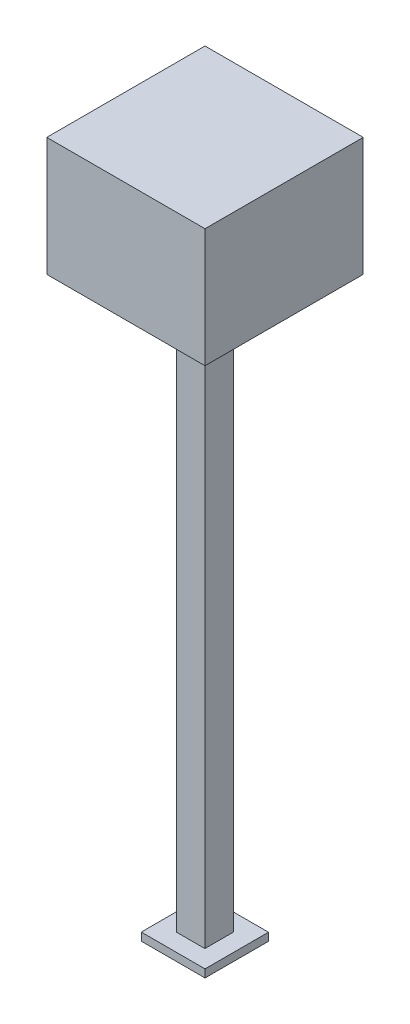
ISO-10303-21;
HEADER;
FILE_DESCRIPTION(('STEP AP214'),'2;1');
FILE_NAME('part.step','',(''),(''),'','','');
FILE_SCHEMA(('AUTOMOTIVE_DESIGN { 1 0 10303 214 1 1 1 1 }'));
ENDSEC;
DATA;
#1=APPLICATION_CONTEXT('core data for automotive mechanical design processes');
#2=APPLICATION_PROTOCOL_DEFINITION('international standard','automotive_design',2000,#1);
#3=PRODUCT_CONTEXT('',#1,'mechanical');
#4=PRODUCT('Part','Part','',(#3));
#5=PRODUCT_RELATED_PRODUCT_CATEGORY('part','',(#4));
#6=PRODUCT_DEFINITION_FORMATION('','',#4);
#7=PRODUCT_DEFINITION_CONTEXT('part definition',#1,'design');
#8=PRODUCT_DEFINITION('design','',#6,#7);
#9=PRODUCT_DEFINITION_SHAPE('','',#8);
#10=(LENGTH_UNIT() NAMED_UNIT(*) SI_UNIT(.MILLI.,.METRE.));
#11=(NAMED_UNIT(*) PLANE_ANGLE_UNIT() SI_UNIT($,.RADIAN.));
#12=(NAMED_UNIT(*) SI_UNIT($,.STERADIAN.) SOLID_ANGLE_UNIT());
#13=UNCERTAINTY_MEASURE_WITH_UNIT(LENGTH_MEASURE(1.E-05),#10,'distance_accuracy_value','');
#14=(GEOMETRIC_REPRESENTATION_CONTEXT(3) GLOBAL_UNCERTAINTY_ASSIGNED_CONTEXT((#13)) GLOBAL_UNIT_ASSIGNED_CONTEXT((#10,
#11,#12)) REPRESENTATION_CONTEXT('',''));
#15=CARTESIAN_POINT('',(0.,0.,0.));
#16=DIRECTION('',(0.,0.,1.));
#17=DIRECTION('',(1.,0.,0.));
#18=AXIS2_PLACEMENT_3D('',#15,#16,#17);
#19=CARTESIAN_POINT('',(0.,360.,0.));
#20=DIRECTION('',(-1.,0.,0.));
#21=DIRECTION('',(0.,0.,1.));
#22=AXIS2_PLACEMENT_3D('',#19,#20,#21);
#23=PLANE('',#22);
#24=DIRECTION('',(0.,0.,-1.));
#25=VECTOR('',#24,1.);
#26=CARTESIAN_POINT('',(0.,0.,0.));
#27=LINE('',#26,#25);
#28=CARTESIAN_POINT('',(0.,0.,0.));
#29=VERTEX_POINT('',#28);
#30=CARTESIAN_POINT('',(0.,0.,-18.));
#31=VERTEX_POINT('',#30);
#32=EDGE_CURVE('E205',#29,#31,#27,.T.);
#33=ORIENTED_EDGE('',*,*,#32,.T.);
#34=DIRECTION('',(0.,-1.,0.));
#35=VECTOR('',#34,1.);
#36=CARTESIAN_POINT('',(0.,360.,-18.));
#37=LINE('',#36,#35);
#38=CARTESIAN_POINT('',(0.,360.,-18.));
#39=VERTEX_POINT('',#38);
#40=EDGE_CURVE('E11',#39,#31,#37,.T.);
#41=ORIENTED_EDGE('',*,*,#40,.F.);
#42=DIRECTION('',(0.,0.,-1.));
#43=VECTOR('',#42,1.);
#44=CARTESIAN_POINT('',(0.,360.,0.));
#45=LINE('',#44,#43);
#46=CARTESIAN_POINT('',(0.,360.,0.));
#47=VERTEX_POINT('',#46);
#48=EDGE_CURVE('E206',#47,#39,#45,.T.);
#49=ORIENTED_EDGE('',*,*,#48,.F.);
#50=DIRECTION('',(0.,-1.,0.));
#51=VECTOR('',#50,1.);
#52=CARTESIAN_POINT('',(0.,360.,0.));
#53=LINE('',#52,#51);
#54=EDGE_CURVE('E223',#47,#29,#53,.T.);
#55=ORIENTED_EDGE('',*,*,#54,.T.);
#56=EDGE_LOOP('',(#33,#41,#49,#55));
#57=FACE_BOUND('',#56,.T.);
#58=ADVANCED_FACE('F43',(#57),#23,.F.);
#59=CARTESIAN_POINT('',(0.,360.,-18.));
#60=DIRECTION('',(0.,0.,1.));
#61=DIRECTION('',(1.,0.,0.));
#62=AXIS2_PLACEMENT_3D('',#59,#60,#61);
#63=PLANE('',#62);
#64=DIRECTION('',(-1.,0.,0.));
#65=VECTOR('',#64,1.);
#66=CARTESIAN_POINT('',(0.,0.,-18.));
#67=LINE('',#66,#65);
#68=CARTESIAN_POINT('',(-18.,0.,-18.));
#69=VERTEX_POINT('',#68);
#70=EDGE_CURVE('E227',#31,#69,#67,.T.);
#71=ORIENTED_EDGE('',*,*,#70,.T.);
#72=DIRECTION('',(0.,-1.,0.));
#73=VECTOR('',#72,1.);
#74=CARTESIAN_POINT('',(-18.,360.,-18.));
#75=LINE('',#74,#73);
#76=CARTESIAN_POINT('',(-18.,360.,-18.));
#77=VERTEX_POINT('',#76);
#78=EDGE_CURVE('E52',#77,#69,#75,.T.);
#79=ORIENTED_EDGE('',*,*,#78,.F.);
#80=DIRECTION('',(-1.,0.,0.));
#81=VECTOR('',#80,1.);
#82=CARTESIAN_POINT('',(0.,360.,-18.));
#83=LINE('',#82,#81);
#84=EDGE_CURVE('E210',#39,#77,#83,.T.);
#85=ORIENTED_EDGE('',*,*,#84,.F.);
#86=ORIENTED_EDGE('',*,*,#40,.T.);
#87=EDGE_LOOP('',(#71,#79,#85,#86));
#88=FACE_BOUND('',#87,.T.);
#89=ADVANCED_FACE('F246',(#88),#63,.F.);
#90=CARTESIAN_POINT('',(-18.,360.,0.));
#91=DIRECTION('',(1.,0.,0.));
#92=DIRECTION('',(0.,0.,-1.));
#93=AXIS2_PLACEMENT_3D('',#90,#91,#92);
#94=PLANE('',#93);
#95=DIRECTION('',(0.,0.,1.));
#96=VECTOR('',#95,1.);
#97=CARTESIAN_POINT('',(-18.,0.,0.));
#98=LINE('',#97,#96);
#99=CARTESIAN_POINT('',(-18.,0.,0.));
#100=VERTEX_POINT('',#99);
#101=EDGE_CURVE('E231',#69,#100,#98,.T.);
#102=ORIENTED_EDGE('',*,*,#101,.T.);
#103=DIRECTION('',(0.,-1.,0.));
#104=VECTOR('',#103,1.);
#105=CARTESIAN_POINT('',(-18.,360.,0.));
#106=LINE('',#105,#104);
#107=CARTESIAN_POINT('',(-18.,360.,0.));
#108=VERTEX_POINT('',#107);
#109=EDGE_CURVE('E59',#108,#100,#106,.T.);
#110=ORIENTED_EDGE('',*,*,#109,.F.);
#111=DIRECTION('',(0.,0.,1.));
#112=VECTOR('',#111,1.);
#113=CARTESIAN_POINT('',(-18.,360.,0.));
#114=LINE('',#113,#112);
#115=EDGE_CURVE('E215',#77,#108,#114,.T.);
#116=ORIENTED_EDGE('',*,*,#115,.F.);
#117=ORIENTED_EDGE('',*,*,#78,.T.);
#118=EDGE_LOOP('',(#102,#110,#116,#117));
#119=FACE_BOUND('',#118,.T.);
#120=ADVANCED_FACE('F243',(#119),#94,.F.);
#121=CARTESIAN_POINT('',(0.,360.,0.));
#122=DIRECTION('',(0.,0.,-1.));
#123=DIRECTION('',(-1.,0.,0.));
#124=AXIS2_PLACEMENT_3D('',#121,#122,#123);
#125=PLANE('',#124);
#126=DIRECTION('',(1.,0.,0.));
#127=VECTOR('',#126,1.);
#128=CARTESIAN_POINT('',(0.,0.,0.));
#129=LINE('',#128,#127);
#130=EDGE_CURVE('E211',#100,#29,#129,.T.);
#131=ORIENTED_EDGE('',*,*,#130,.T.);
#132=ORIENTED_EDGE('',*,*,#54,.F.);
#133=DIRECTION('',(1.,0.,0.));
#134=VECTOR('',#133,1.);
#135=CARTESIAN_POINT('',(0.,360.,0.));
#136=LINE('',#135,#134);
#137=EDGE_CURVE('E219',#108,#47,#136,.T.);
#138=ORIENTED_EDGE('',*,*,#137,.F.);
#139=ORIENTED_EDGE('',*,*,#109,.T.);
#140=EDGE_LOOP('',(#131,#132,#138,#139));
#141=FACE_BOUND('',#140,.T.);
#142=ADVANCED_FACE('F253',(#141),#125,.F.);
#143=CARTESIAN_POINT('',(0.,360.,0.));
#144=DIRECTION('',(0.,1.,0.));
#145=DIRECTION('',(0.,0.,1.));
#146=AXIS2_PLACEMENT_3D('',#143,#144,#145);
#147=PLANE('',#146);
#148=DIRECTION('',(0.,0.,1.));
#149=VECTOR('',#148,1.);
#150=CARTESIAN_POINT('',(-58.9613730566852,360.,40.9632642239142));
#151=LINE('',#150,#149);
#152=CARTESIAN_POINT('',(-58.9613730566852,360.,-59.0367357760859));
#153=VERTEX_POINT('',#152);
#154=CARTESIAN_POINT('',(-58.9613730566852,360.,40.9632642239142));
#155=VERTEX_POINT('',#154);
#156=EDGE_CURVE('E157',#153,#155,#151,.T.);
#157=ORIENTED_EDGE('',*,*,#156,.F.);
#158=DIRECTION('',(-1.,0.,0.));
#159=VECTOR('',#158,1.);
#160=CARTESIAN_POINT('',(41.0386269433146,360.,-59.0367357760859));
#161=LINE('',#160,#159);
#162=CARTESIAN_POINT('',(41.0386269433146,360.,-59.0367357760859));
#163=VERTEX_POINT('',#162);
#164=EDGE_CURVE('E173',#163,#153,#161,.T.);
#165=ORIENTED_EDGE('',*,*,#164,.F.);
#166=DIRECTION('',(0.,0.,-1.));
#167=VECTOR('',#166,1.);
#168=CARTESIAN_POINT('',(41.0386269433146,360.,40.9632642239142));
#169=LINE('',#168,#167);
#170=CARTESIAN_POINT('',(41.0386269433146,360.,40.9632642239142));
#171=VERTEX_POINT('',#170);
#172=EDGE_CURVE('E185',#171,#163,#169,.T.);
#173=ORIENTED_EDGE('',*,*,#172,.F.);
#174=DIRECTION('',(1.,0.,0.));
#175=VECTOR('',#174,1.);
#176=CARTESIAN_POINT('',(41.0386269433146,360.,40.9632642239142));
#177=LINE('',#176,#175);
#178=EDGE_CURVE('E162',#155,#171,#177,.T.);
#179=ORIENTED_EDGE('',*,*,#178,.F.);
#180=EDGE_LOOP('',(#157,#165,#173,#179));
#181=FACE_BOUND('',#180,.T.);
#182=ORIENTED_EDGE('',*,*,#137,.T.);
#183=ORIENTED_EDGE('',*,*,#48,.T.);
#184=ORIENTED_EDGE('',*,*,#84,.T.);
#185=ORIENTED_EDGE('',*,*,#115,.T.);
#186=EDGE_LOOP('',(#182,#183,#184,#185));
#187=FACE_BOUND('',#186,.T.);
#188=ADVANCED_FACE('F256',(#181,#187),#147,.F.);
#189=CARTESIAN_POINT('',(-58.9613730566852,435.,40.9632642239142));
#190=DIRECTION('',(1.,0.,0.));
#191=DIRECTION('',(0.,0.,-1.));
#192=AXIS2_PLACEMENT_3D('',#189,#190,#191);
#193=PLANE('',#192);
#194=ORIENTED_EDGE('',*,*,#156,.T.);
#195=DIRECTION('',(0.,-1.,0.));
#196=VECTOR('',#195,1.);
#197=CARTESIAN_POINT('',(-58.9613730566852,435.,40.9632642239142));
#198=LINE('',#197,#196);
#199=CARTESIAN_POINT('',(-58.9613730566852,435.,40.9632642239142));
#200=VERTEX_POINT('',#199);
#201=EDGE_CURVE('E201',#200,#155,#198,.T.);
#202=ORIENTED_EDGE('',*,*,#201,.F.);
#203=DIRECTION('',(0.,0.,1.));
#204=VECTOR('',#203,1.);
#205=CARTESIAN_POINT('',(-58.9613730566852,435.,40.9632642239142));
#206=LINE('',#205,#204);
#207=CARTESIAN_POINT('',(-58.9613730566852,435.,-59.0367357760859));
#208=VERTEX_POINT('',#207);
#209=EDGE_CURVE('E168',#208,#200,#206,.T.);
#210=ORIENTED_EDGE('',*,*,#209,.F.);
#211=DIRECTION('',(0.,-1.,0.));
#212=VECTOR('',#211,1.);
#213=CARTESIAN_POINT('',(-58.9613730566852,435.,-59.0367357760859));
#214=LINE('',#213,#212);
#215=EDGE_CURVE('E181',#208,#153,#214,.T.);
#216=ORIENTED_EDGE('',*,*,#215,.T.);
#217=EDGE_LOOP('',(#194,#202,#210,#216));
#218=FACE_BOUND('',#217,.T.);
#219=ADVANCED_FACE('F258',(#218),#193,.F.);
#220=CARTESIAN_POINT('',(41.0386269433146,435.,40.9632642239142));
#221=DIRECTION('',(0.,0.,-1.));
#222=DIRECTION('',(-1.,0.,0.));
#223=AXIS2_PLACEMENT_3D('',#220,#221,#222);
#224=PLANE('',#223);
#225=ORIENTED_EDGE('',*,*,#178,.T.);
#226=DIRECTION('',(0.,-1.,0.));
#227=VECTOR('',#226,1.);
#228=CARTESIAN_POINT('',(41.0386269433146,435.,40.9632642239142));
#229=LINE('',#228,#227);
#230=CARTESIAN_POINT('',(41.0386269433146,435.,40.9632642239142));
#231=VERTEX_POINT('',#230);
#232=EDGE_CURVE('E197',#231,#171,#229,.T.);
#233=ORIENTED_EDGE('',*,*,#232,.F.);
#234=DIRECTION('',(1.,0.,0.));
#235=VECTOR('',#234,1.);
#236=CARTESIAN_POINT('',(41.0386269433146,435.,40.9632642239142));
#237=LINE('',#236,#235);
#238=EDGE_CURVE('E172',#200,#231,#237,.T.);
#239=ORIENTED_EDGE('',*,*,#238,.F.);
#240=ORIENTED_EDGE('',*,*,#201,.T.);
#241=EDGE_LOOP('',(#225,#233,#239,#240));
#242=FACE_BOUND('',#241,.T.);
#243=ADVANCED_FACE('F265',(#242),#224,.F.);
#244=CARTESIAN_POINT('',(41.0386269433146,435.,40.9632642239142));
#245=DIRECTION('',(-1.,0.,0.));
#246=DIRECTION('',(0.,0.,1.));
#247=AXIS2_PLACEMENT_3D('',#244,#245,#246);
#248=PLANE('',#247);
#249=ORIENTED_EDGE('',*,*,#172,.T.);
#250=DIRECTION('',(0.,-1.,0.));
#251=VECTOR('',#250,1.);
#252=CARTESIAN_POINT('',(41.0386269433146,435.,-59.0367357760859));
#253=LINE('',#252,#251);
#254=CARTESIAN_POINT('',(41.0386269433146,435.,-59.0367357760859));
#255=VERTEX_POINT('',#254);
#256=EDGE_CURVE('E193',#255,#163,#253,.T.);
#257=ORIENTED_EDGE('',*,*,#256,.F.);
#258=DIRECTION('',(0.,0.,-1.));
#259=VECTOR('',#258,1.);
#260=CARTESIAN_POINT('',(41.0386269433146,435.,40.9632642239142));
#261=LINE('',#260,#259);
#262=EDGE_CURVE('E176',#231,#255,#261,.T.);
#263=ORIENTED_EDGE('',*,*,#262,.F.);
#264=ORIENTED_EDGE('',*,*,#232,.T.);
#265=EDGE_LOOP('',(#249,#257,#263,#264));
#266=FACE_BOUND('',#265,.T.);
#267=ADVANCED_FACE('F283',(#266),#248,.F.);
#268=CARTESIAN_POINT('',(41.0386269433146,435.,-59.0367357760859));
#269=DIRECTION('',(0.,0.,1.));
#270=DIRECTION('',(1.,0.,0.));
#271=AXIS2_PLACEMENT_3D('',#268,#269,#270);
#272=PLANE('',#271);
#273=ORIENTED_EDGE('',*,*,#164,.T.);
#274=ORIENTED_EDGE('',*,*,#215,.F.);
#275=DIRECTION('',(-1.,0.,0.));
#276=VECTOR('',#275,1.);
#277=CARTESIAN_POINT('',(41.0386269433146,435.,-59.0367357760859));
#278=LINE('',#277,#276);
#279=EDGE_CURVE('E179',#255,#208,#278,.T.);
#280=ORIENTED_EDGE('',*,*,#279,.F.);
#281=ORIENTED_EDGE('',*,*,#256,.T.);
#282=EDGE_LOOP('',(#273,#274,#280,#281));
#283=FACE_BOUND('',#282,.T.);
#284=ADVANCED_FACE('F286',(#283),#272,.F.);
#285=CARTESIAN_POINT('',(0.,435.,0.));
#286=DIRECTION('',(0.,1.,0.));
#287=DIRECTION('',(0.,0.,1.));
#288=AXIS2_PLACEMENT_3D('',#285,#286,#287);
#289=PLANE('',#288);
#290=ORIENTED_EDGE('',*,*,#209,.T.);
#291=ORIENTED_EDGE('',*,*,#238,.T.);
#292=ORIENTED_EDGE('',*,*,#262,.T.);
#293=ORIENTED_EDGE('',*,*,#279,.T.);
#294=EDGE_LOOP('',(#290,#291,#292,#293));
#295=FACE_BOUND('',#294,.T.);
#296=ADVANCED_FACE('F289',(#295),#289,.T.);
#297=CARTESIAN_POINT('',(-29.1457218555619,-4.99999999999982,-29.0574032089465));
#298=DIRECTION('',(1.,0.,0.));
#299=DIRECTION('',(0.,0.,-1.));
#300=AXIS2_PLACEMENT_3D('',#297,#298,#299);
#301=PLANE('',#300);
#302=DIRECTION('',(0.,0.,-1.));
#303=VECTOR('',#302,1.);
#304=CARTESIAN_POINT('',(-29.1457218555619,0.,-29.0574032089465));
#305=LINE('',#304,#303);
#306=CARTESIAN_POINT('',(-29.1457218555619,0.,11.0574032089465));
#307=VERTEX_POINT('',#306);
#308=CARTESIAN_POINT('',(-29.1457218555619,0.,-29.0574032089465));
#309=VERTEX_POINT('',#308);
#310=EDGE_CURVE('E155',#307,#309,#305,.T.);
#311=ORIENTED_EDGE('',*,*,#310,.T.);
#312=DIRECTION('',(0.,1.,0.));
#313=VECTOR('',#312,1.);
#314=CARTESIAN_POINT('',(-29.1457218555619,-4.99999999999982,-29.0574032089465));
#315=LINE('',#314,#313);
#316=CARTESIAN_POINT('',(-29.1457218555619,-4.99999999999982,-29.0574032089465));
#317=VERTEX_POINT('',#316);
#318=EDGE_CURVE('E133',#317,#309,#315,.T.);
#319=ORIENTED_EDGE('',*,*,#318,.F.);
#320=DIRECTION('',(0.,0.,-1.));
#321=VECTOR('',#320,1.);
#322=CARTESIAN_POINT('',(-29.1457218555619,-4.99999999999982,-29.0574032089465));
#323=LINE('',#322,#321);
#324=CARTESIAN_POINT('',(-29.1457218555619,-4.99999999999982,11.0574032089465));
#325=VERTEX_POINT('',#324);
#326=EDGE_CURVE('E141',#325,#317,#323,.T.);
#327=ORIENTED_EDGE('',*,*,#326,.F.);
#328=DIRECTION('',(0.,1.,0.));
#329=VECTOR('',#328,1.);
#330=CARTESIAN_POINT('',(-29.1457218555619,-4.99999999999982,11.0574032089465));
#331=LINE('',#330,#329);
#332=EDGE_CURVE('E442',#325,#307,#331,.T.);
#333=ORIENTED_EDGE('',*,*,#332,.T.);
#334=EDGE_LOOP('',(#311,#319,#327,#333));
#335=FACE_BOUND('',#334,.T.);
#336=ADVANCED_FACE('F153',(#335),#301,.F.);
#337=CARTESIAN_POINT('',(11.1457218555619,-4.99999999999982,-29.0574032089465));
#338=DIRECTION('',(0.,0.,1.));
#339=DIRECTION('',(1.,0.,0.));
#340=AXIS2_PLACEMENT_3D('',#337,#338,#339);
#341=PLANE('',#340);
#342=DIRECTION('',(1.,0.,0.));
#343=VECTOR('',#342,1.);
#344=CARTESIAN_POINT('',(11.1457218555619,0.,-29.0574032089465));
#345=LINE('',#344,#343);
#346=CARTESIAN_POINT('',(11.1457218555619,0.,-29.0574032089465));
#347=VERTEX_POINT('',#346);
#348=EDGE_CURVE('E450',#309,#347,#345,.T.);
#349=ORIENTED_EDGE('',*,*,#348,.T.);
#350=DIRECTION('',(0.,1.,0.));
#351=VECTOR('',#350,1.);
#352=CARTESIAN_POINT('',(11.1457218555619,-4.99999999999982,-29.0574032089465));
#353=LINE('',#352,#351);
#354=CARTESIAN_POINT('',(11.1457218555619,-4.99999999999982,-29.0574032089465));
#355=VERTEX_POINT('',#354);
#356=EDGE_CURVE('E136',#355,#347,#353,.T.);
#357=ORIENTED_EDGE('',*,*,#356,.F.);
#358=DIRECTION('',(1.,0.,0.));
#359=VECTOR('',#358,1.);
#360=CARTESIAN_POINT('',(11.1457218555619,-4.99999999999982,-29.0574032089465));
#361=LINE('',#360,#359);
#362=EDGE_CURVE('E129',#317,#355,#361,.T.);
#363=ORIENTED_EDGE('',*,*,#362,.F.);
#364=ORIENTED_EDGE('',*,*,#318,.T.);
#365=EDGE_LOOP('',(#349,#357,#363,#364));
#366=FACE_BOUND('',#365,.T.);
#367=ADVANCED_FACE('F131',(#366),#341,.F.);
#368=CARTESIAN_POINT('',(11.1457218555619,-4.99999999999982,-29.0574032089465));
#369=DIRECTION('',(-1.,0.,0.));
#370=DIRECTION('',(0.,0.,1.));
#371=AXIS2_PLACEMENT_3D('',#368,#369,#370);
#372=PLANE('',#371);
#373=DIRECTION('',(0.,0.,1.));
#374=VECTOR('',#373,1.);
#375=CARTESIAN_POINT('',(11.1457218555619,0.,-29.0574032089465));
#376=LINE('',#375,#374);
#377=CARTESIAN_POINT('',(11.1457218555619,0.,11.0574032089465));
#378=VERTEX_POINT('',#377);
#379=EDGE_CURVE('E446',#347,#378,#376,.T.);
#380=ORIENTED_EDGE('',*,*,#379,.T.);
#381=DIRECTION('',(0.,1.,0.));
#382=VECTOR('',#381,1.);
#383=CARTESIAN_POINT('',(11.1457218555619,-4.99999999999982,11.0574032089465));
#384=LINE('',#383,#382);
#385=CARTESIAN_POINT('',(11.1457218555619,-4.99999999999982,11.0574032089465));
#386=VERTEX_POINT('',#385);
#387=EDGE_CURVE('E164',#386,#378,#384,.T.);
#388=ORIENTED_EDGE('',*,*,#387,.F.);
#389=DIRECTION('',(0.,0.,1.));
#390=VECTOR('',#389,1.);
#391=CARTESIAN_POINT('',(11.1457218555619,-4.99999999999982,-29.0574032089465));
#392=LINE('',#391,#390);
#393=EDGE_CURVE('E140',#355,#386,#392,.T.);
#394=ORIENTED_EDGE('',*,*,#393,.F.);
#395=ORIENTED_EDGE('',*,*,#356,.T.);
#396=EDGE_LOOP('',(#380,#388,#394,#395));
#397=FACE_BOUND('',#396,.T.);
#398=ADVANCED_FACE('F311',(#397),#372,.F.);
#399=CARTESIAN_POINT('',(11.1457218555619,-4.99999999999982,11.0574032089465));
#400=DIRECTION('',(0.,0.,-1.));
#401=DIRECTION('',(-1.,0.,0.));
#402=AXIS2_PLACEMENT_3D('',#399,#400,#401);
#403=PLANE('',#402);
#404=DIRECTION('',(-1.,0.,0.));
#405=VECTOR('',#404,1.);
#406=CARTESIAN_POINT('',(11.1457218555619,0.,11.0574032089465));
#407=LINE('',#406,#405);
#408=EDGE_CURVE('E151',#378,#307,#407,.T.);
#409=ORIENTED_EDGE('',*,*,#408,.T.);
#410=ORIENTED_EDGE('',*,*,#332,.F.);
#411=DIRECTION('',(-1.,0.,0.));
#412=VECTOR('',#411,1.);
#413=CARTESIAN_POINT('',(11.1457218555619,-4.99999999999982,11.0574032089465));
#414=LINE('',#413,#412);
#415=EDGE_CURVE('E146',#386,#325,#414,.T.);
#416=ORIENTED_EDGE('',*,*,#415,.F.);
#417=ORIENTED_EDGE('',*,*,#387,.T.);
#418=EDGE_LOOP('',(#409,#410,#416,#417));
#419=FACE_BOUND('',#418,.T.);
#420=ADVANCED_FACE('F314',(#419),#403,.F.);
#421=CARTESIAN_POINT('',(0.,-4.99999999999982,0.));
#422=DIRECTION('',(0.,-1.,0.));
#423=DIRECTION('',(0.,0.,-1.));
#424=AXIS2_PLACEMENT_3D('',#421,#422,#423);
#425=PLANE('',#424);
#426=ORIENTED_EDGE('',*,*,#326,.T.);
#427=ORIENTED_EDGE('',*,*,#362,.T.);
#428=ORIENTED_EDGE('',*,*,#393,.T.);
#429=ORIENTED_EDGE('',*,*,#415,.T.);
#430=EDGE_LOOP('',(#426,#427,#428,#429));
#431=FACE_BOUND('',#430,.T.);
#432=ADVANCED_FACE('F144',(#431),#425,.T.);
#433=CARTESIAN_POINT('',(0.,0.,0.));
#434=DIRECTION('',(0.,-1.,0.));
#435=DIRECTION('',(0.,0.,-1.));
#436=AXIS2_PLACEMENT_3D('',#433,#434,#435);
#437=PLANE('',#436);
#438=ORIENTED_EDGE('',*,*,#32,.F.);
#439=ORIENTED_EDGE('',*,*,#130,.F.);
#440=ORIENTED_EDGE('',*,*,#101,.F.);
#441=ORIENTED_EDGE('',*,*,#70,.F.);
#442=EDGE_LOOP('',(#438,#439,#440,#441));
#443=FACE_BOUND('',#442,.T.);
#444=ORIENTED_EDGE('',*,*,#310,.F.);
#445=ORIENTED_EDGE('',*,*,#408,.F.);
#446=ORIENTED_EDGE('',*,*,#379,.F.);
#447=ORIENTED_EDGE('',*,*,#348,.F.);
#448=EDGE_LOOP('',(#444,#445,#446,#447));
#449=FACE_BOUND('',#448,.T.);
#450=ADVANCED_FACE('F249',(#443,#449),#437,.F.);
#451=CLOSED_SHELL('',(#58,#89,#120,#142,#188,#219,#243,#267,#284,#296,#336,#367,#398,#420,#432,#450));
#452=MANIFOLD_SOLID_BREP('B2',#451);
#453=ADVANCED_BREP_SHAPE_REPRESENTATION('',(#18,#452),#14);
#454=SHAPE_DEFINITION_REPRESENTATION(#9,#453);
ENDSEC;
END-ISO-10303-21;
